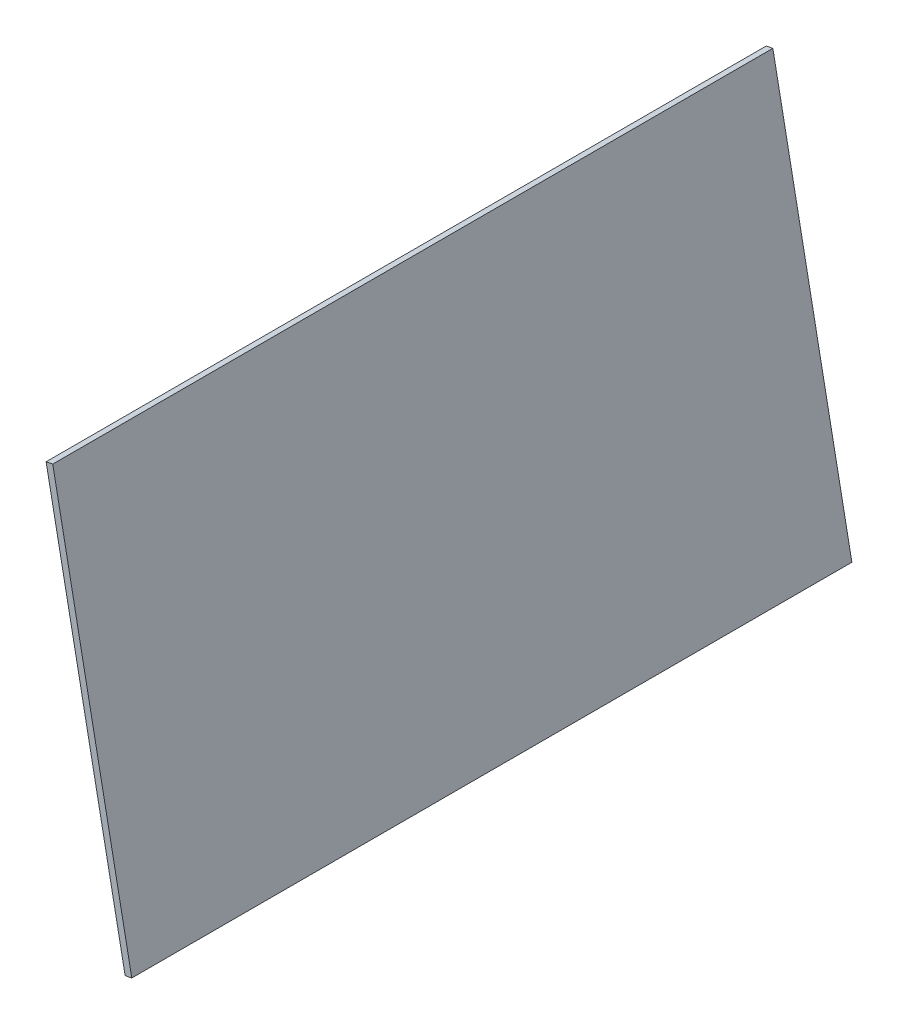
ISO-10303-21;
HEADER;
FILE_DESCRIPTION(('STEP AP214'),'2;1');
FILE_NAME('part.step','',(''),(''),'','','');
FILE_SCHEMA(('AUTOMOTIVE_DESIGN { 1 0 10303 214 1 1 1 1 }'));
ENDSEC;
DATA;
#1=APPLICATION_CONTEXT('core data for automotive mechanical design processes');
#2=APPLICATION_PROTOCOL_DEFINITION('international standard','automotive_design',2000,#1);
#3=PRODUCT_CONTEXT('',#1,'mechanical');
#4=PRODUCT('Part','Part','',(#3));
#5=PRODUCT_RELATED_PRODUCT_CATEGORY('part','',(#4));
#6=PRODUCT_DEFINITION_FORMATION('','',#4);
#7=PRODUCT_DEFINITION_CONTEXT('part definition',#1,'design');
#8=PRODUCT_DEFINITION('design','',#6,#7);
#9=PRODUCT_DEFINITION_SHAPE('','',#8);
#10=(LENGTH_UNIT() NAMED_UNIT(*) SI_UNIT(.MILLI.,.METRE.));
#11=(NAMED_UNIT(*) PLANE_ANGLE_UNIT() SI_UNIT($,.RADIAN.));
#12=(NAMED_UNIT(*) SI_UNIT($,.STERADIAN.) SOLID_ANGLE_UNIT());
#13=UNCERTAINTY_MEASURE_WITH_UNIT(LENGTH_MEASURE(1.E-05),#10,'distance_accuracy_value','');
#14=(GEOMETRIC_REPRESENTATION_CONTEXT(3) GLOBAL_UNCERTAINTY_ASSIGNED_CONTEXT((#13)) GLOBAL_UNIT_ASSIGNED_CONTEXT((#10,
#11,#12)) REPRESENTATION_CONTEXT('',''));
#15=CARTESIAN_POINT('',(0.,0.,0.));
#16=DIRECTION('',(0.,0.,1.));
#17=DIRECTION('',(1.,0.,0.));
#18=AXIS2_PLACEMENT_3D('',#15,#16,#17);
#19=CARTESIAN_POINT('',(-740.165567995293,313.968457793888,-160.));
#20=DIRECTION('',(0.,0.,-1.));
#21=DIRECTION('',(-1.,0.,0.));
#22=AXIS2_PLACEMENT_3D('',#19,#20,#21);
#23=PLANE('',#22);
#24=DIRECTION('',(-0.191325578408073,0.981526628801693,0.));
#25=VECTOR('',#24,1.);
#26=CARTESIAN_POINT('',(-737.220988108888,314.542434529112,-160.));
#27=LINE('',#26,#25);
#28=CARTESIAN_POINT('',(-702.09390671147,134.335657837118,-160.));
#29=VERTEX_POINT('',#28);
#30=CARTESIAN_POINT('',(-737.220988108888,314.542434529112,-160.));
#31=VERTEX_POINT('',#30);
#32=EDGE_CURVE('E99',#29,#31,#27,.T.);
#33=ORIENTED_EDGE('',*,*,#32,.F.);
#34=DIRECTION('',(0.981526628801693,0.191325578408073,0.));
#35=VECTOR('',#34,1.);
#36=CARTESIAN_POINT('',(-705.038486597875,133.761681101893,-160.));
#37=LINE('',#36,#35);
#38=CARTESIAN_POINT('',(-705.038486597875,133.761681101893,-160.));
#39=VERTEX_POINT('',#38);
#40=EDGE_CURVE('E11',#39,#29,#37,.T.);
#41=ORIENTED_EDGE('',*,*,#40,.F.);
#42=DIRECTION('',(-0.191325578408073,0.981526628801693,0.));
#43=VECTOR('',#42,1.);
#44=CARTESIAN_POINT('',(-740.165567995293,313.968457793888,-160.));
#45=LINE('',#44,#43);
#46=CARTESIAN_POINT('',(-740.165567995293,313.968457793888,-160.));
#47=VERTEX_POINT('',#46);
#48=EDGE_CURVE('E92',#39,#47,#45,.T.);
#49=ORIENTED_EDGE('',*,*,#48,.T.);
#50=DIRECTION('',(0.981526628801693,0.191325578408073,0.));
#51=VECTOR('',#50,1.);
#52=CARTESIAN_POINT('',(-740.165567995293,313.968457793888,-160.));
#53=LINE('',#52,#51);
#54=EDGE_CURVE('E37',#47,#31,#53,.T.);
#55=ORIENTED_EDGE('',*,*,#54,.T.);
#56=EDGE_LOOP('',(#33,#41,#49,#55));
#57=FACE_BOUND('',#56,.T.);
#58=ADVANCED_FACE('F34',(#57),#23,.T.);
#59=CARTESIAN_POINT('',(-705.038486597875,133.761681101893,160.));
#60=DIRECTION('',(0.191325578408073,-0.981526628801693,0.));
#61=DIRECTION('',(0.981526628801693,0.191325578408073,0.));
#62=AXIS2_PLACEMENT_3D('',#59,#60,#61);
#63=PLANE('',#62);
#64=DIRECTION('',(0.,0.,-1.));
#65=VECTOR('',#64,1.);
#66=CARTESIAN_POINT('',(-702.09390671147,134.335657837118,160.));
#67=LINE('',#66,#65);
#68=CARTESIAN_POINT('',(-702.09390671147,134.335657837118,160.));
#69=VERTEX_POINT('',#68);
#70=EDGE_CURVE('E94',#69,#29,#67,.T.);
#71=ORIENTED_EDGE('',*,*,#70,.F.);
#72=DIRECTION('',(0.981526628801693,0.191325578408073,0.));
#73=VECTOR('',#72,1.);
#74=CARTESIAN_POINT('',(-705.038486597875,133.761681101893,160.));
#75=LINE('',#74,#73);
#76=CARTESIAN_POINT('',(-705.038486597875,133.761681101893,160.));
#77=VERTEX_POINT('',#76);
#78=EDGE_CURVE('E43',#77,#69,#75,.T.);
#79=ORIENTED_EDGE('',*,*,#78,.F.);
#80=DIRECTION('',(0.,0.,-1.));
#81=VECTOR('',#80,1.);
#82=CARTESIAN_POINT('',(-705.038486597875,133.761681101893,160.));
#83=LINE('',#82,#81);
#84=EDGE_CURVE('E89',#77,#39,#83,.T.);
#85=ORIENTED_EDGE('',*,*,#84,.T.);
#86=ORIENTED_EDGE('',*,*,#40,.T.);
#87=EDGE_LOOP('',(#71,#79,#85,#86));
#88=FACE_BOUND('',#87,.T.);
#89=ADVANCED_FACE('F110',(#88),#63,.T.);
#90=CARTESIAN_POINT('',(-740.165567995293,313.968457793888,160.));
#91=DIRECTION('',(0.,0.,1.));
#92=DIRECTION('',(1.,0.,0.));
#93=AXIS2_PLACEMENT_3D('',#90,#91,#92);
#94=PLANE('',#93);
#95=DIRECTION('',(0.191325578408073,-0.981526628801693,0.));
#96=VECTOR('',#95,1.);
#97=CARTESIAN_POINT('',(-737.220988108888,314.542434529112,160.));
#98=LINE('',#97,#96);
#99=CARTESIAN_POINT('',(-737.220988108888,314.542434529112,160.));
#100=VERTEX_POINT('',#99);
#101=EDGE_CURVE('E84',#100,#69,#98,.T.);
#102=ORIENTED_EDGE('',*,*,#101,.F.);
#103=DIRECTION('',(0.981526628801693,0.191325578408073,0.));
#104=VECTOR('',#103,1.);
#105=CARTESIAN_POINT('',(-740.165567995293,313.968457793888,160.));
#106=LINE('',#105,#104);
#107=CARTESIAN_POINT('',(-740.165567995293,313.968457793888,160.));
#108=VERTEX_POINT('',#107);
#109=EDGE_CURVE('E79',#108,#100,#106,.T.);
#110=ORIENTED_EDGE('',*,*,#109,.F.);
#111=DIRECTION('',(0.191325578408073,-0.981526628801693,0.));
#112=VECTOR('',#111,1.);
#113=CARTESIAN_POINT('',(-740.165567995293,313.968457793888,160.));
#114=LINE('',#113,#112);
#115=EDGE_CURVE('E82',#108,#77,#114,.T.);
#116=ORIENTED_EDGE('',*,*,#115,.T.);
#117=ORIENTED_EDGE('',*,*,#78,.T.);
#118=EDGE_LOOP('',(#102,#110,#116,#117));
#119=FACE_BOUND('',#118,.T.);
#120=ADVANCED_FACE('F81',(#119),#94,.T.);
#121=CARTESIAN_POINT('',(-740.165567995293,313.968457793888,160.));
#122=DIRECTION('',(-0.191325578408073,0.981526628801693,0.));
#123=DIRECTION('',(-0.981526628801693,-0.191325578408073,0.));
#124=AXIS2_PLACEMENT_3D('',#121,#122,#123);
#125=PLANE('',#124);
#126=DIRECTION('',(0.,0.,1.));
#127=VECTOR('',#126,1.);
#128=CARTESIAN_POINT('',(-737.220988108888,314.542434529112,160.));
#129=LINE('',#128,#127);
#130=EDGE_CURVE('E102',#31,#100,#129,.T.);
#131=ORIENTED_EDGE('',*,*,#130,.F.);
#132=ORIENTED_EDGE('',*,*,#54,.F.);
#133=DIRECTION('',(0.,0.,1.));
#134=VECTOR('',#133,1.);
#135=CARTESIAN_POINT('',(-740.165567995293,313.968457793888,160.));
#136=LINE('',#135,#134);
#137=EDGE_CURVE('E88',#47,#108,#136,.T.);
#138=ORIENTED_EDGE('',*,*,#137,.T.);
#139=ORIENTED_EDGE('',*,*,#109,.T.);
#140=EDGE_LOOP('',(#131,#132,#138,#139));
#141=FACE_BOUND('',#140,.T.);
#142=ADVANCED_FACE('F91',(#141),#125,.T.);
#143=CARTESIAN_POINT('',(-654.110956608439,-127.503578042458,0.));
#144=DIRECTION('',(0.981526628801693,0.191325578408073,0.));
#145=DIRECTION('',(-0.191325578408073,0.981526628801693,0.));
#146=AXIS2_PLACEMENT_3D('',#143,#144,#145);
#147=PLANE('',#146);
#148=CARTESIAN_POINT('',(-734.425800643051,284.522658929837,-148.));
#149=DIRECTION('',(-0.981526628801693,-0.191325578408073,0.));
#150=DIRECTION('',(0.191325578408073,-0.981526628801693,0.));
#151=AXIS2_PLACEMENT_3D('',#148,#149,#150);
#152=CIRCLE('',#151,2.00000000000001);
#153=CARTESIAN_POINT('',(-734.043149486235,282.559605672234,-148.));
#154=VERTEX_POINT('',#153);
#155=EDGE_CURVE('E166',#154,#154,#152,.T.);
#156=ORIENTED_EDGE('',*,*,#155,.F.);
#157=EDGE_LOOP('',(#156));
#158=FACE_BOUND('',#157,.T.);
#159=CARTESIAN_POINT('',(-719.158166885239,206.19759012946,-148.));
#160=DIRECTION('',(-0.981526628801693,-0.191325578408073,0.));
#161=DIRECTION('',(0.191325578408073,-0.981526628801693,0.));
#162=AXIS2_PLACEMENT_3D('',#159,#160,#161);
#163=CIRCLE('',#162,2.);
#164=CARTESIAN_POINT('',(-718.775515728423,204.234536871857,-148.));
#165=VERTEX_POINT('',#164);
#166=EDGE_CURVE('E174',#165,#165,#163,.T.);
#167=ORIENTED_EDGE('',*,*,#166,.F.);
#168=EDGE_LOOP('',(#167));
#169=FACE_BOUND('',#168,.T.);
#170=CARTESIAN_POINT('',(-712.691509734199,173.022746253961,148.));
#171=DIRECTION('',(-0.981526628801693,-0.191325578408073,0.));
#172=DIRECTION('',(0.191325578408073,-0.981526628801693,0.));
#173=AXIS2_PLACEMENT_3D('',#170,#171,#172);
#174=CIRCLE('',#173,1.99999999999999);
#175=CARTESIAN_POINT('',(-712.308858577382,171.059692996358,148.));
#176=VERTEX_POINT('',#175);
#177=EDGE_CURVE('E180',#176,#176,#174,.T.);
#178=ORIENTED_EDGE('',*,*,#177,.F.);
#179=EDGE_LOOP('',(#178));
#180=FACE_BOUND('',#179,.T.);
#181=CARTESIAN_POINT('',(-726.811190021562,245.458655281528,148.));
#182=DIRECTION('',(-0.981526628801693,-0.191325578408073,0.));
#183=DIRECTION('',(0.191325578408073,-0.981526628801693,0.));
#184=AXIS2_PLACEMENT_3D('',#181,#182,#183);
#185=CIRCLE('',#184,2.);
#186=CARTESIAN_POINT('',(-726.428538864746,243.495602023924,148.));
#187=VERTEX_POINT('',#186);
#188=EDGE_CURVE('E185',#187,#187,#185,.T.);
#189=ORIENTED_EDGE('',*,*,#188,.F.);
#190=EDGE_LOOP('',(#189));
#191=FACE_BOUND('',#190,.T.);
#192=ORIENTED_EDGE('',*,*,#48,.F.);
#193=ORIENTED_EDGE('',*,*,#84,.F.);
#194=ORIENTED_EDGE('',*,*,#115,.F.);
#195=ORIENTED_EDGE('',*,*,#137,.F.);
#196=EDGE_LOOP('',(#192,#193,#194,#195));
#197=FACE_BOUND('',#196,.T.);
#198=ADVANCED_FACE('F87',(#158,#169,#180,#191,#197),#147,.F.);
#199=CARTESIAN_POINT('',(-651.166376722034,-126.929601307234,0.));
#200=DIRECTION('',(0.981526628801693,0.191325578408073,0.));
#201=DIRECTION('',(-0.191325578408073,0.981526628801693,0.));
#202=AXIS2_PLACEMENT_3D('',#199,#200,#201);
#203=PLANE('',#202);
#204=ORIENTED_EDGE('',*,*,#32,.T.);
#205=ORIENTED_EDGE('',*,*,#130,.T.);
#206=ORIENTED_EDGE('',*,*,#101,.T.);
#207=ORIENTED_EDGE('',*,*,#70,.T.);
#208=EDGE_LOOP('',(#204,#205,#206,#207));
#209=FACE_BOUND('',#208,.T.);
#210=ADVANCED_FACE('F109',(#209),#203,.T.);
#211=CARTESIAN_POINT('',(-725.829663392761,245.649980859936,148.));
#212=DIRECTION('',(-0.981526628801693,-0.191325578408073,0.));
#213=DIRECTION('',(0.191325578408073,-0.981526628801693,0.));
#214=AXIS2_PLACEMENT_3D('',#211,#212,#213);
#215=CYLINDRICAL_SURFACE('',#214,2.);
#216=CARTESIAN_POINT('',(-725.829663392761,245.649980859936,148.));
#217=DIRECTION('',(-0.981526628801693,-0.191325578408073,0.));
#218=DIRECTION('',(0.191325578408073,-0.981526628801693,0.));
#219=AXIS2_PLACEMENT_3D('',#216,#217,#218);
#220=CIRCLE('',#219,2.);
#221=CARTESIAN_POINT('',(-725.447012235944,243.686927602332,148.));
#222=VERTEX_POINT('',#221);
#223=EDGE_CURVE('E183',#222,#222,#220,.T.);
#224=ORIENTED_EDGE('',*,*,#223,.F.);
#225=EDGE_LOOP('',(#224));
#226=FACE_BOUND('',#225,.T.);
#227=ORIENTED_EDGE('',*,*,#188,.T.);
#228=EDGE_LOOP('',(#227));
#229=FACE_BOUND('',#228,.T.);
#230=ADVANCED_FACE('F128',(#226,#229),#215,.F.);
#231=CARTESIAN_POINT('',(-725.829663392761,245.649980859936,148.));
#232=DIRECTION('',(-0.981526628801693,-0.191325578408073,0.));
#233=DIRECTION('',(0.191325578408073,-0.981526628801693,0.));
#234=AXIS2_PLACEMENT_3D('',#231,#232,#233);
#235=PLANE('',#234);
#236=ORIENTED_EDGE('',*,*,#223,.T.);
#237=EDGE_LOOP('',(#236));
#238=FACE_BOUND('',#237,.T.);
#239=ADVANCED_FACE('F134',(#238),#235,.T.);
#240=CARTESIAN_POINT('',(-711.709983105397,173.214071832369,148.));
#241=DIRECTION('',(-0.981526628801693,-0.191325578408073,0.));
#242=DIRECTION('',(0.191325578408073,-0.981526628801693,0.));
#243=AXIS2_PLACEMENT_3D('',#240,#241,#242);
#244=CYLINDRICAL_SURFACE('',#243,1.99999999999999);
#245=CARTESIAN_POINT('',(-711.709983105397,173.214071832369,148.));
#246=DIRECTION('',(-0.981526628801693,-0.191325578408073,0.));
#247=DIRECTION('',(0.191325578408073,-0.981526628801693,0.));
#248=AXIS2_PLACEMENT_3D('',#245,#246,#247);
#249=CIRCLE('',#248,1.99999999999999);
#250=CARTESIAN_POINT('',(-711.327331948581,171.251018574766,148.));
#251=VERTEX_POINT('',#250);
#252=EDGE_CURVE('E177',#251,#251,#249,.T.);
#253=ORIENTED_EDGE('',*,*,#252,.F.);
#254=EDGE_LOOP('',(#253));
#255=FACE_BOUND('',#254,.T.);
#256=ORIENTED_EDGE('',*,*,#177,.T.);
#257=EDGE_LOOP('',(#256));
#258=FACE_BOUND('',#257,.T.);
#259=ADVANCED_FACE('F138',(#255,#258),#244,.F.);
#260=CARTESIAN_POINT('',(-711.709983105397,173.214071832369,148.));
#261=DIRECTION('',(-0.981526628801693,-0.191325578408073,0.));
#262=DIRECTION('',(0.191325578408073,-0.981526628801693,0.));
#263=AXIS2_PLACEMENT_3D('',#260,#261,#262);
#264=PLANE('',#263);
#265=ORIENTED_EDGE('',*,*,#252,.T.);
#266=EDGE_LOOP('',(#265));
#267=FACE_BOUND('',#266,.T.);
#268=ADVANCED_FACE('F142',(#267),#264,.T.);
#269=CARTESIAN_POINT('',(-718.176640256438,206.388915707868,-148.));
#270=DIRECTION('',(-0.981526628801693,-0.191325578408073,0.));
#271=DIRECTION('',(0.191325578408073,-0.981526628801693,0.));
#272=AXIS2_PLACEMENT_3D('',#269,#270,#271);
#273=CYLINDRICAL_SURFACE('',#272,2.);
#274=CARTESIAN_POINT('',(-718.176640256438,206.388915707868,-148.));
#275=DIRECTION('',(-0.981526628801693,-0.191325578408073,0.));
#276=DIRECTION('',(0.191325578408073,-0.981526628801693,0.));
#277=AXIS2_PLACEMENT_3D('',#274,#275,#276);
#278=CIRCLE('',#277,2.);
#279=CARTESIAN_POINT('',(-717.793989099621,204.425862450265,-148.));
#280=VERTEX_POINT('',#279);
#281=EDGE_CURVE('E169',#280,#280,#278,.T.);
#282=ORIENTED_EDGE('',*,*,#281,.F.);
#283=EDGE_LOOP('',(#282));
#284=FACE_BOUND('',#283,.T.);
#285=ORIENTED_EDGE('',*,*,#166,.T.);
#286=EDGE_LOOP('',(#285));
#287=FACE_BOUND('',#286,.T.);
#288=ADVANCED_FACE('F146',(#284,#287),#273,.F.);
#289=CARTESIAN_POINT('',(-718.176640256438,206.388915707868,-148.));
#290=DIRECTION('',(-0.981526628801693,-0.191325578408073,0.));
#291=DIRECTION('',(0.191325578408073,-0.981526628801693,0.));
#292=AXIS2_PLACEMENT_3D('',#289,#290,#291);
#293=PLANE('',#292);
#294=ORIENTED_EDGE('',*,*,#281,.T.);
#295=EDGE_LOOP('',(#294));
#296=FACE_BOUND('',#295,.T.);
#297=ADVANCED_FACE('F150',(#296),#293,.T.);
#298=CARTESIAN_POINT('',(-733.44427401425,284.713984508245,-148.));
#299=DIRECTION('',(-0.981526628801693,-0.191325578408073,0.));
#300=DIRECTION('',(0.191325578408073,-0.981526628801693,0.));
#301=AXIS2_PLACEMENT_3D('',#298,#299,#300);
#302=CYLINDRICAL_SURFACE('',#301,2.00000000000001);
#303=CARTESIAN_POINT('',(-733.44427401425,284.713984508245,-148.));
#304=DIRECTION('',(-0.981526628801693,-0.191325578408073,0.));
#305=DIRECTION('',(0.191325578408073,-0.981526628801693,0.));
#306=AXIS2_PLACEMENT_3D('',#303,#304,#305);
#307=CIRCLE('',#306,2.00000000000001);
#308=CARTESIAN_POINT('',(-733.061622857434,282.750931250642,-148.));
#309=VERTEX_POINT('',#308);
#310=EDGE_CURVE('E103',#309,#309,#307,.T.);
#311=ORIENTED_EDGE('',*,*,#310,.F.);
#312=EDGE_LOOP('',(#311));
#313=FACE_BOUND('',#312,.T.);
#314=ORIENTED_EDGE('',*,*,#155,.T.);
#315=EDGE_LOOP('',(#314));
#316=FACE_BOUND('',#315,.T.);
#317=ADVANCED_FACE('F154',(#313,#316),#302,.F.);
#318=CARTESIAN_POINT('',(-733.44427401425,284.713984508245,-148.));
#319=DIRECTION('',(-0.981526628801693,-0.191325578408073,0.));
#320=DIRECTION('',(0.191325578408073,-0.981526628801693,0.));
#321=AXIS2_PLACEMENT_3D('',#318,#319,#320);
#322=PLANE('',#321);
#323=ORIENTED_EDGE('',*,*,#310,.T.);
#324=EDGE_LOOP('',(#323));
#325=FACE_BOUND('',#324,.T.);
#326=ADVANCED_FACE('F158',(#325),#322,.T.);
#327=CLOSED_SHELL('',(#58,#89,#120,#142,#198,#210,#230,#239,#259,#268,#288,#297,#317,#326));
#328=MANIFOLD_SOLID_BREP('B2',#327);
#329=ADVANCED_BREP_SHAPE_REPRESENTATION('',(#18,#328),#14);
#330=SHAPE_DEFINITION_REPRESENTATION(#9,#329);
ENDSEC;
END-ISO-10303-21;
